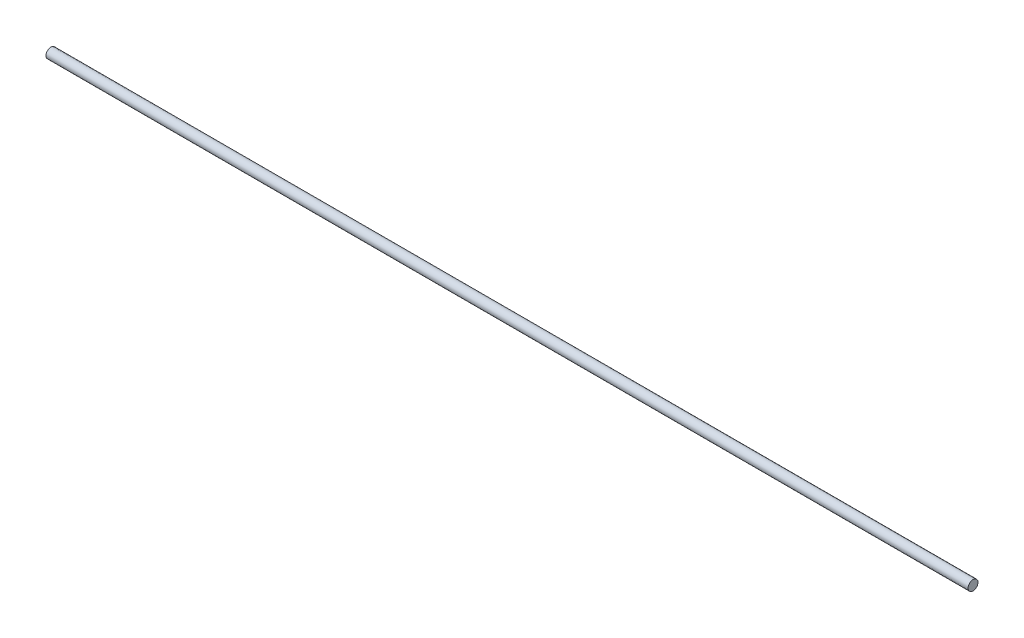
ISO-10303-21;
HEADER;
FILE_DESCRIPTION(('STEP AP214'),'2;1');
FILE_NAME('part.step','',(''),(''),'','','');
FILE_SCHEMA(('AUTOMOTIVE_DESIGN { 1 0 10303 214 1 1 1 1 }'));
ENDSEC;
DATA;
#1=APPLICATION_CONTEXT('core data for automotive mechanical design processes');
#2=APPLICATION_PROTOCOL_DEFINITION('international standard','automotive_design',2000,#1);
#3=PRODUCT_CONTEXT('',#1,'mechanical');
#4=PRODUCT('Part','Part','',(#3));
#5=PRODUCT_RELATED_PRODUCT_CATEGORY('part','',(#4));
#6=PRODUCT_DEFINITION_FORMATION('','',#4);
#7=PRODUCT_DEFINITION_CONTEXT('part definition',#1,'design');
#8=PRODUCT_DEFINITION('design','',#6,#7);
#9=PRODUCT_DEFINITION_SHAPE('','',#8);
#10=(LENGTH_UNIT() NAMED_UNIT(*) SI_UNIT(.MILLI.,.METRE.));
#11=(NAMED_UNIT(*) PLANE_ANGLE_UNIT() SI_UNIT($,.RADIAN.));
#12=(NAMED_UNIT(*) SI_UNIT($,.STERADIAN.) SOLID_ANGLE_UNIT());
#13=UNCERTAINTY_MEASURE_WITH_UNIT(LENGTH_MEASURE(1.E-05),#10,'distance_accuracy_value','');
#14=(GEOMETRIC_REPRESENTATION_CONTEXT(3) GLOBAL_UNCERTAINTY_ASSIGNED_CONTEXT((#13)) GLOBAL_UNIT_ASSIGNED_CONTEXT((#10,
#11,#12)) REPRESENTATION_CONTEXT('',''));
#15=CARTESIAN_POINT('',(0.,0.,0.));
#16=DIRECTION('',(0.,0.,1.));
#17=DIRECTION('',(1.,0.,0.));
#18=AXIS2_PLACEMENT_3D('',#15,#16,#17);
#19=CARTESIAN_POINT('',(746.,0.,0.));
#20=DIRECTION('',(-1.,0.,0.));
#21=DIRECTION('',(0.,0.,1.));
#22=AXIS2_PLACEMENT_3D('',#19,#20,#21);
#23=CYLINDRICAL_SURFACE('',#22,4.);
#24=CARTESIAN_POINT('',(746.,0.,0.));
#25=DIRECTION('',(1.,0.,0.));
#26=DIRECTION('',(0.,0.,-1.));
#27=AXIS2_PLACEMENT_3D('',#24,#25,#26);
#28=CIRCLE('',#27,4.);
#29=CARTESIAN_POINT('',(746.,0.,-4.));
#30=VERTEX_POINT('',#29);
#31=EDGE_CURVE('E12',#30,#30,#28,.T.);
#32=ORIENTED_EDGE('',*,*,#31,.F.);
#33=EDGE_LOOP('',(#32));
#34=FACE_BOUND('',#33,.T.);
#35=CARTESIAN_POINT('',(0.,0.,0.));
#36=DIRECTION('',(1.,0.,0.));
#37=DIRECTION('',(0.,0.,-1.));
#38=AXIS2_PLACEMENT_3D('',#35,#36,#37);
#39=CIRCLE('',#38,4.);
#40=CARTESIAN_POINT('',(0.,0.,-4.));
#41=VERTEX_POINT('',#40);
#42=EDGE_CURVE('E45',#41,#41,#39,.T.);
#43=ORIENTED_EDGE('',*,*,#42,.T.);
#44=EDGE_LOOP('',(#43));
#45=FACE_BOUND('',#44,.T.);
#46=ADVANCED_FACE('F42',(#34,#45),#23,.T.);
#47=CARTESIAN_POINT('',(746.,0.,0.));
#48=DIRECTION('',(1.,0.,0.));
#49=DIRECTION('',(0.,0.,-1.));
#50=AXIS2_PLACEMENT_3D('',#47,#48,#49);
#51=PLANE('',#50);
#52=ORIENTED_EDGE('',*,*,#31,.T.);
#53=EDGE_LOOP('',(#52));
#54=FACE_BOUND('',#53,.T.);
#55=ADVANCED_FACE('F57',(#54),#51,.T.);
#56=CARTESIAN_POINT('',(0.,0.,0.));
#57=DIRECTION('',(1.,0.,0.));
#58=DIRECTION('',(0.,0.,-1.));
#59=AXIS2_PLACEMENT_3D('',#56,#57,#58);
#60=PLANE('',#59);
#61=ORIENTED_EDGE('',*,*,#42,.F.);
#62=EDGE_LOOP('',(#61));
#63=FACE_BOUND('',#62,.T.);
#64=ADVANCED_FACE('F55',(#63),#60,.F.);
#65=CLOSED_SHELL('',(#46,#55,#64));
#66=MANIFOLD_SOLID_BREP('B2',#65);
#67=ADVANCED_BREP_SHAPE_REPRESENTATION('',(#18,#66),#14);
#68=SHAPE_DEFINITION_REPRESENTATION(#9,#67);
ENDSEC;
END-ISO-10303-21;
